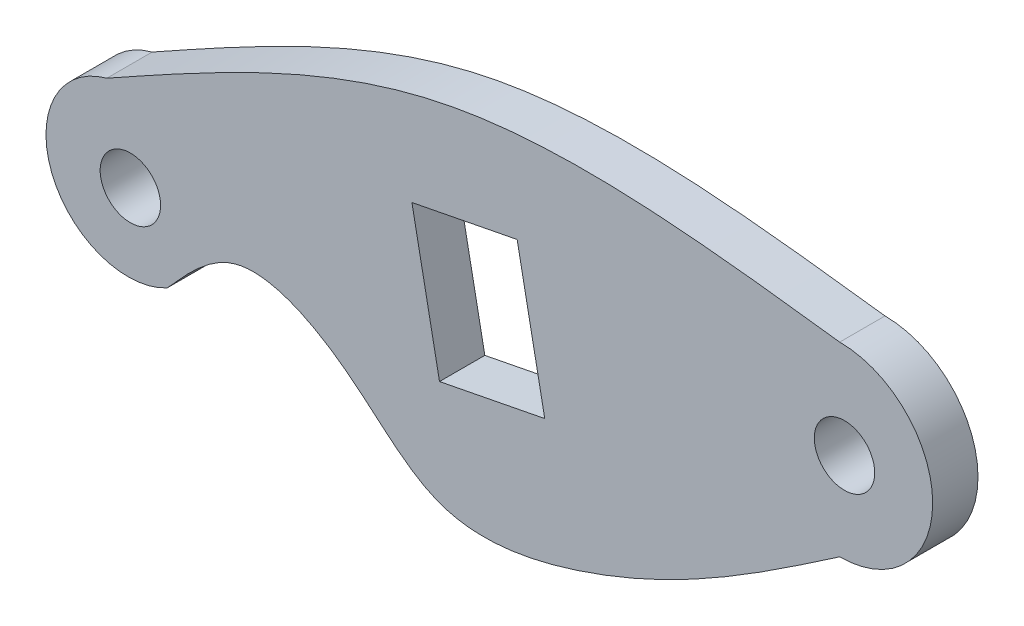
ISO-10303-21;
HEADER;
FILE_DESCRIPTION(('STEP AP214'),'2;1');
FILE_NAME('part.step','',(''),(''),'','','');
FILE_SCHEMA(('AUTOMOTIVE_DESIGN { 1 0 10303 214 1 1 1 1 }'));
ENDSEC;
DATA;
#1=APPLICATION_CONTEXT('core data for automotive mechanical design processes');
#2=APPLICATION_PROTOCOL_DEFINITION('international standard','automotive_design',2000,#1);
#3=PRODUCT_CONTEXT('',#1,'mechanical');
#4=PRODUCT('Part','Part','',(#3));
#5=PRODUCT_RELATED_PRODUCT_CATEGORY('part','',(#4));
#6=PRODUCT_DEFINITION_FORMATION('','',#4);
#7=PRODUCT_DEFINITION_CONTEXT('part definition',#1,'design');
#8=PRODUCT_DEFINITION('design','',#6,#7);
#9=PRODUCT_DEFINITION_SHAPE('','',#8);
#10=(LENGTH_UNIT() NAMED_UNIT(*) SI_UNIT(.MILLI.,.METRE.));
#11=(NAMED_UNIT(*) PLANE_ANGLE_UNIT() SI_UNIT($,.RADIAN.));
#12=(NAMED_UNIT(*) SI_UNIT($,.STERADIAN.) SOLID_ANGLE_UNIT());
#13=UNCERTAINTY_MEASURE_WITH_UNIT(LENGTH_MEASURE(1.E-05),#10,'distance_accuracy_value','');
#14=(GEOMETRIC_REPRESENTATION_CONTEXT(3) GLOBAL_UNCERTAINTY_ASSIGNED_CONTEXT((#13)) GLOBAL_UNIT_ASSIGNED_CONTEXT((#10,
#11,#12)) REPRESENTATION_CONTEXT('',''));
#15=CARTESIAN_POINT('',(0.,0.,0.));
#16=DIRECTION('',(0.,0.,1.));
#17=DIRECTION('',(1.,0.,0.));
#18=AXIS2_PLACEMENT_3D('',#15,#16,#17);
#19=CARTESIAN_POINT('',(-53.2520142800154,94.8575535673757,1.5));
#20=DIRECTION('',(0.,0.,1.));
#21=DIRECTION('',(1.,0.,0.));
#22=AXIS2_PLACEMENT_3D('',#19,#20,#21);
#23=PLANE('',#22);
#24=CARTESIAN_POINT('',(-64.074442722061,87.1747570230223,1.5));
#25=DIRECTION('',(0.,0.,1.));
#26=DIRECTION('',(1.,0.,0.));
#27=AXIS2_PLACEMENT_3D('',#24,#25,#26);
#28=CIRCLE('',#27,0.999999999999998);
#29=CARTESIAN_POINT('',(-63.074442722061,87.1747570230223,1.5));
#30=VERTEX_POINT('',#29);
#31=EDGE_CURVE('E121',#30,#30,#28,.T.);
#32=ORIENTED_EDGE('',*,*,#31,.F.);
#33=EDGE_LOOP('',(#32));
#34=FACE_BOUND('',#33,.T.);
#35=CARTESIAN_POINT('',(-40.5945010143821,94.4933990390098,1.5));
#36=CARTESIAN_POINT('',(-45.1067328716195,95.062315852806,1.5));
#37=CARTESIAN_POINT('',(-53.7128807725429,96.147406867134,1.5));
#38=CARTESIAN_POINT('',(-61.263255509961,91.9329155214449,1.5));
#39=CARTESIAN_POINT('',(-64.8549437576194,89.9280959512118,1.5));
#40=B_SPLINE_CURVE_WITH_KNOTS('',3,(#35,#36,#37,#38,#39),.UNSPECIFIED.,.F.,.F.,(4,1,4),(0.,
0.5243033130715,1.),.UNSPECIFIED.);
#41=CARTESIAN_POINT('',(-40.5945010143821,94.4933990390098,1.5));
#42=VERTEX_POINT('',#41);
#43=CARTESIAN_POINT('',(-64.8549437576194,89.9280959512118,1.5));
#44=VERTEX_POINT('',#43);
#45=EDGE_CURVE('E158',#42,#44,#40,.T.);
#46=ORIENTED_EDGE('',*,*,#45,.T.);
#47=CARTESIAN_POINT('',(-64.1510312334984,87.30442199767,1.5));
#48=DIRECTION('',(0.,0.,1.));
#49=DIRECTION('',(1.,0.,0.));
#50=AXIS2_PLACEMENT_3D('',#47,#48,#49);
#51=CIRCLE('',#50,2.71646053829389);
#52=CARTESIAN_POINT('',(-62.8550300147779,84.917051331606,1.5));
#53=VERTEX_POINT('',#52);
#54=EDGE_CURVE('E164',#44,#53,#51,.T.);
#55=ORIENTED_EDGE('',*,*,#54,.T.);
#56=CARTESIAN_POINT('',(-62.8550300147779,84.917051331606,1.5));
#57=CARTESIAN_POINT('',(-62.1426354203539,85.7170744292261,1.5));
#58=CARTESIAN_POINT('',(-60.5651319701729,87.4886195905712,1.5));
#59=CARTESIAN_POINT('',(-56.73967505305,85.7547090095442,1.5));
#60=CARTESIAN_POINT('',(-53.9883806957626,82.4347339404592,1.5));
#61=CARTESIAN_POINT('',(-47.13219288297,83.8775894546287,1.5));
#62=CARTESIAN_POINT('',(-43.2268502024927,86.5416881555137,1.5));
#63=CARTESIAN_POINT('',(-40.5945010143821,88.3373917918113,1.5));
#64=B_SPLINE_CURVE_WITH_KNOTS('',3,(#56,#57,#58,#59,#60,#61,#62,#63),.UNSPECIFIED.,.F.,.F.,(4,1,
1,1,1,4),(0.,0.116873357122585,0.258800565779375,0.422862059994074,0.610987124024471,1.),.UNSPECIFIED.);
#65=CARTESIAN_POINT('',(-40.5945010143821,88.3373917918113,1.5));
#66=VERTEX_POINT('',#65);
#67=EDGE_CURVE('E169',#53,#66,#64,.T.);
#68=ORIENTED_EDGE('',*,*,#67,.T.);
#69=CARTESIAN_POINT('',(-40.5945010143821,91.4153954154105,1.5));
#70=DIRECTION('',(0.,0.,1.));
#71=DIRECTION('',(1.,0.,0.));
#72=AXIS2_PLACEMENT_3D('',#69,#70,#71);
#73=CIRCLE('',#72,3.07800362359924);
#74=EDGE_CURVE('E174',#66,#42,#73,.T.);
#75=ORIENTED_EDGE('',*,*,#74,.T.);
#76=EDGE_LOOP('',(#46,#55,#68,#75));
#77=FACE_BOUND('',#76,.T.);
#78=DIRECTION('',(0.191745550151077,-0.981444671898147,0.));
#79=VECTOR('',#78,1.);
#80=CARTESIAN_POINT('',(-54.7545205643772,91.4153954154105,1.5));
#81=LINE('',#80,#79);
#82=CARTESIAN_POINT('',(-54.7545205643772,91.4153954154105,1.5));
#83=VERTEX_POINT('',#82);
#84=CARTESIAN_POINT('',(-53.8409709159905,86.7394150121251,1.5));
#85=VERTEX_POINT('',#84);
#86=EDGE_CURVE('E131',#83,#85,#81,.T.);
#87=ORIENTED_EDGE('',*,*,#86,.F.);
#88=DIRECTION('',(-0.981444671898147,-0.191745550151077,0.));
#89=VECTOR('',#88,1.);
#90=CARTESIAN_POINT('',(-51.2716932879771,92.0958378808049,1.5));
#91=LINE('',#90,#89);
#92=CARTESIAN_POINT('',(-51.2716932879771,92.0958378808049,1.5));
#93=VERTEX_POINT('',#92);
#94=EDGE_CURVE('E114',#93,#83,#91,.T.);
#95=ORIENTED_EDGE('',*,*,#94,.F.);
#96=DIRECTION('',(-0.191745550151077,0.981444671898147,0.));
#97=VECTOR('',#96,1.);
#98=CARTESIAN_POINT('',(-50.3581436395904,87.4198574775194,1.5));
#99=LINE('',#98,#97);
#100=CARTESIAN_POINT('',(-50.3581436395904,87.4198574775194,1.5));
#101=VERTEX_POINT('',#100);
#102=EDGE_CURVE('E135',#101,#93,#99,.T.);
#103=ORIENTED_EDGE('',*,*,#102,.F.);
#104=DIRECTION('',(0.981444671898147,0.191745550151077,0.));
#105=VECTOR('',#104,1.);
#106=CARTESIAN_POINT('',(-53.8409709159905,86.7394150121251,1.5));
#107=LINE('',#106,#105);
#108=EDGE_CURVE('E133',#85,#101,#107,.T.);
#109=ORIENTED_EDGE('',*,*,#108,.F.);
#110=EDGE_LOOP('',(#87,#95,#103,#109));
#111=FACE_BOUND('',#110,.T.);
#112=CARTESIAN_POINT('',(-40.4356239967167,91.3227986417033,1.5));
#113=DIRECTION('',(0.,0.,1.));
#114=DIRECTION('',(1.,0.,0.));
#115=AXIS2_PLACEMENT_3D('',#112,#113,#114);
#116=CIRCLE('',#115,0.999999999999998);
#117=CARTESIAN_POINT('',(-39.4356239967167,91.3227986417033,1.5));
#118=VERTEX_POINT('',#117);
#119=EDGE_CURVE('E226',#118,#118,#116,.T.);
#120=ORIENTED_EDGE('',*,*,#119,.F.);
#121=EDGE_LOOP('',(#120));
#122=FACE_BOUND('',#121,.T.);
#123=ADVANCED_FACE('F33',(#34,#77,#111,#122),#23,.T.);
#124=CARTESIAN_POINT('',(-53.2520142800154,94.8575535673757,0.));
#125=DIRECTION('',(0.,0.,1.));
#126=DIRECTION('',(1.,0.,0.));
#127=AXIS2_PLACEMENT_3D('',#124,#125,#126);
#128=PLANE('',#127);
#129=CARTESIAN_POINT('',(-64.074442722061,87.1747570230223,0.));
#130=DIRECTION('',(0.,0.,1.));
#131=DIRECTION('',(1.,0.,0.));
#132=AXIS2_PLACEMENT_3D('',#129,#130,#131);
#133=CIRCLE('',#132,0.999999999999998);
#134=CARTESIAN_POINT('',(-63.074442722061,87.1747570230223,0.));
#135=VERTEX_POINT('',#134);
#136=EDGE_CURVE('E124',#135,#135,#133,.T.);
#137=ORIENTED_EDGE('',*,*,#136,.T.);
#138=EDGE_LOOP('',(#137));
#139=FACE_BOUND('',#138,.T.);
#140=CARTESIAN_POINT('',(-40.5945010143821,94.4933990390098,0.));
#141=CARTESIAN_POINT('',(-45.1067328716195,95.062315852806,0.));
#142=CARTESIAN_POINT('',(-53.7128807725429,96.147406867134,0.));
#143=CARTESIAN_POINT('',(-61.263255509961,91.9329155214449,0.));
#144=CARTESIAN_POINT('',(-64.8549437576194,89.9280959512118,0.));
#145=B_SPLINE_CURVE_WITH_KNOTS('',3,(#140,#141,#142,#143,#144),.UNSPECIFIED.,.F.,.F.,(4,1,4),
(0.,0.5243033130715,1.),.UNSPECIFIED.);
#146=CARTESIAN_POINT('',(-40.5945010143821,94.4933990390098,0.));
#147=VERTEX_POINT('',#146);
#148=CARTESIAN_POINT('',(-64.8549437576194,89.9280959512118,0.));
#149=VERTEX_POINT('',#148);
#150=EDGE_CURVE('E115',#147,#149,#145,.T.);
#151=ORIENTED_EDGE('',*,*,#150,.F.);
#152=CARTESIAN_POINT('',(-40.5945010143821,91.4153954154105,0.));
#153=DIRECTION('',(0.,0.,1.));
#154=DIRECTION('',(1.,0.,0.));
#155=AXIS2_PLACEMENT_3D('',#152,#153,#154);
#156=CIRCLE('',#155,3.07800362359924);
#157=CARTESIAN_POINT('',(-40.5945010143821,88.3373917918113,0.));
#158=VERTEX_POINT('',#157);
#159=EDGE_CURVE('E154',#158,#147,#156,.T.);
#160=ORIENTED_EDGE('',*,*,#159,.F.);
#161=CARTESIAN_POINT('',(-62.8550300147779,84.917051331606,0.));
#162=CARTESIAN_POINT('',(-62.1426354203539,85.7170744292261,0.));
#163=CARTESIAN_POINT('',(-60.5651319701729,87.4886195905712,0.));
#164=CARTESIAN_POINT('',(-56.73967505305,85.7547090095442,0.));
#165=CARTESIAN_POINT('',(-53.9883806957626,82.4347339404592,0.));
#166=CARTESIAN_POINT('',(-47.13219288297,83.8775894546287,0.));
#167=CARTESIAN_POINT('',(-43.2268502024927,86.5416881555137,0.));
#168=CARTESIAN_POINT('',(-40.5945010143821,88.3373917918113,0.));
#169=B_SPLINE_CURVE_WITH_KNOTS('',3,(#161,#162,#163,#164,#165,#166,#167,#168),.UNSPECIFIED.,.F.,
.F.,(4,1,1,1,1,4),(0.,0.116873357122585,0.258800565779375,0.422862059994074,0.610987124024471,
1.),.UNSPECIFIED.);
#170=CARTESIAN_POINT('',(-62.8550300147779,84.917051331606,0.));
#171=VERTEX_POINT('',#170);
#172=EDGE_CURVE('E150',#171,#158,#169,.T.);
#173=ORIENTED_EDGE('',*,*,#172,.F.);
#174=CARTESIAN_POINT('',(-64.1510312334984,87.30442199767,0.));
#175=DIRECTION('',(0.,0.,1.));
#176=DIRECTION('',(1.,0.,0.));
#177=AXIS2_PLACEMENT_3D('',#174,#175,#176);
#178=CIRCLE('',#177,2.71646053829389);
#179=EDGE_CURVE('E145',#149,#171,#178,.T.);
#180=ORIENTED_EDGE('',*,*,#179,.F.);
#181=EDGE_LOOP('',(#151,#160,#173,#180));
#182=FACE_BOUND('',#181,.T.);
#183=DIRECTION('',(-0.981444671898147,-0.191745550151077,0.));
#184=VECTOR('',#183,1.);
#185=CARTESIAN_POINT('',(-51.2716932879771,92.0958378808049,0.));
#186=LINE('',#185,#184);
#187=CARTESIAN_POINT('',(-51.2716932879771,92.0958378808049,0.));
#188=VERTEX_POINT('',#187);
#189=CARTESIAN_POINT('',(-54.7545205643772,91.4153954154105,0.));
#190=VERTEX_POINT('',#189);
#191=EDGE_CURVE('E57',#188,#190,#186,.T.);
#192=ORIENTED_EDGE('',*,*,#191,.T.);
#193=DIRECTION('',(0.191745550151077,-0.981444671898147,0.));
#194=VECTOR('',#193,1.);
#195=CARTESIAN_POINT('',(-54.7545205643772,91.4153954154105,0.));
#196=LINE('',#195,#194);
#197=CARTESIAN_POINT('',(-53.8409709159905,86.7394150121251,0.));
#198=VERTEX_POINT('',#197);
#199=EDGE_CURVE('E101',#190,#198,#196,.T.);
#200=ORIENTED_EDGE('',*,*,#199,.T.);
#201=DIRECTION('',(0.981444671898147,0.191745550151077,0.));
#202=VECTOR('',#201,1.);
#203=CARTESIAN_POINT('',(-53.8409709159905,86.7394150121251,0.));
#204=LINE('',#203,#202);
#205=CARTESIAN_POINT('',(-50.3581436395904,87.4198574775194,0.));
#206=VERTEX_POINT('',#205);
#207=EDGE_CURVE('E110',#198,#206,#204,.T.);
#208=ORIENTED_EDGE('',*,*,#207,.T.);
#209=DIRECTION('',(-0.191745550151077,0.981444671898147,0.));
#210=VECTOR('',#209,1.);
#211=CARTESIAN_POINT('',(-50.3581436395904,87.4198574775194,0.));
#212=LINE('',#211,#210);
#213=EDGE_CURVE('E120',#206,#188,#212,.T.);
#214=ORIENTED_EDGE('',*,*,#213,.T.);
#215=EDGE_LOOP('',(#192,#200,#208,#214));
#216=FACE_BOUND('',#215,.T.);
#217=CARTESIAN_POINT('',(-40.4356239967167,91.3227986417033,0.));
#218=DIRECTION('',(0.,0.,1.));
#219=DIRECTION('',(1.,0.,0.));
#220=AXIS2_PLACEMENT_3D('',#217,#218,#219);
#221=CIRCLE('',#220,0.999999999999998);
#222=CARTESIAN_POINT('',(-39.4356239967167,91.3227986417033,0.));
#223=VERTEX_POINT('',#222);
#224=EDGE_CURVE('E229',#223,#223,#221,.T.);
#225=ORIENTED_EDGE('',*,*,#224,.T.);
#226=EDGE_LOOP('',(#225));
#227=FACE_BOUND('',#226,.T.);
#228=ADVANCED_FACE('F118',(#139,#182,#216,#227),#128,.F.);
#229=DIRECTION('',(0.,0.,-1.));
#230=VECTOR('',#229,1.);
#231=SURFACE_OF_LINEAR_EXTRUSION('',#40,#230);
#232=ORIENTED_EDGE('',*,*,#150,.T.);
#233=DIRECTION('',(0.,0.,-1.));
#234=VECTOR('',#233,1.);
#235=CARTESIAN_POINT('',(-64.8549437576194,89.9280959512118,1.5));
#236=LINE('',#235,#234);
#237=EDGE_CURVE('E11',#44,#149,#236,.T.);
#238=ORIENTED_EDGE('',*,*,#237,.F.);
#239=ORIENTED_EDGE('',*,*,#45,.F.);
#240=DIRECTION('',(0.,0.,-1.));
#241=VECTOR('',#240,1.);
#242=CARTESIAN_POINT('',(-40.5945010143821,94.4933990390098,1.5));
#243=LINE('',#242,#241);
#244=EDGE_CURVE('E243',#42,#147,#243,.T.);
#245=ORIENTED_EDGE('',*,*,#244,.T.);
#246=EDGE_LOOP('',(#232,#238,#239,#245));
#247=FACE_BOUND('',#246,.T.);
#248=ADVANCED_FACE('F35',(#247),#231,.F.);
#249=CARTESIAN_POINT('',(-64.1510312334984,87.30442199767,1.5));
#250=DIRECTION('',(0.,0.,-1.));
#251=DIRECTION('',(-1.,0.,0.));
#252=AXIS2_PLACEMENT_3D('',#249,#250,#251);
#253=CYLINDRICAL_SURFACE('',#252,2.71646053829389);
#254=ORIENTED_EDGE('',*,*,#179,.T.);
#255=DIRECTION('',(0.,0.,-1.));
#256=VECTOR('',#255,1.);
#257=CARTESIAN_POINT('',(-62.8550300147779,84.917051331606,1.5));
#258=LINE('',#257,#256);
#259=EDGE_CURVE('E42',#53,#171,#258,.T.);
#260=ORIENTED_EDGE('',*,*,#259,.F.);
#261=ORIENTED_EDGE('',*,*,#54,.F.);
#262=ORIENTED_EDGE('',*,*,#237,.T.);
#263=EDGE_LOOP('',(#254,#260,#261,#262));
#264=FACE_BOUND('',#263,.T.);
#265=ADVANCED_FACE('F184',(#264),#253,.T.);
#266=DIRECTION('',(0.,0.,-1.));
#267=VECTOR('',#266,1.);
#268=SURFACE_OF_LINEAR_EXTRUSION('',#64,#267);
#269=ORIENTED_EDGE('',*,*,#172,.T.);
#270=DIRECTION('',(0.,0.,-1.));
#271=VECTOR('',#270,1.);
#272=CARTESIAN_POINT('',(-40.5945010143821,88.3373917918113,1.5));
#273=LINE('',#272,#271);
#274=EDGE_CURVE('E246',#66,#158,#273,.T.);
#275=ORIENTED_EDGE('',*,*,#274,.F.);
#276=ORIENTED_EDGE('',*,*,#67,.F.);
#277=ORIENTED_EDGE('',*,*,#259,.T.);
#278=EDGE_LOOP('',(#269,#275,#276,#277));
#279=FACE_BOUND('',#278,.T.);
#280=ADVANCED_FACE('F180',(#279),#268,.F.);
#281=CARTESIAN_POINT('',(-40.5945010143821,91.4153954154105,1.5));
#282=DIRECTION('',(0.,0.,-1.));
#283=DIRECTION('',(-1.,0.,0.));
#284=AXIS2_PLACEMENT_3D('',#281,#282,#283);
#285=CYLINDRICAL_SURFACE('',#284,3.07800362359924);
#286=ORIENTED_EDGE('',*,*,#159,.T.);
#287=ORIENTED_EDGE('',*,*,#244,.F.);
#288=ORIENTED_EDGE('',*,*,#74,.F.);
#289=ORIENTED_EDGE('',*,*,#274,.T.);
#290=EDGE_LOOP('',(#286,#287,#288,#289));
#291=FACE_BOUND('',#290,.T.);
#292=ADVANCED_FACE('F183',(#291),#285,.T.);
#293=CARTESIAN_POINT('',(-51.2716932879771,92.0958378808049,1.5));
#294=DIRECTION('',(0.191745550151077,-0.981444671898147,0.));
#295=DIRECTION('',(0.981444671898147,0.191745550151077,0.));
#296=AXIS2_PLACEMENT_3D('',#293,#294,#295);
#297=PLANE('',#296);
#298=ORIENTED_EDGE('',*,*,#191,.F.);
#299=DIRECTION('',(0.,0.,-1.));
#300=VECTOR('',#299,1.);
#301=CARTESIAN_POINT('',(-51.2716932879771,92.0958378808049,1.5));
#302=LINE('',#301,#300);
#303=EDGE_CURVE('E137',#93,#188,#302,.T.);
#304=ORIENTED_EDGE('',*,*,#303,.F.);
#305=ORIENTED_EDGE('',*,*,#94,.T.);
#306=DIRECTION('',(0.,0.,-1.));
#307=VECTOR('',#306,1.);
#308=CARTESIAN_POINT('',(-54.7545205643772,91.4153954154105,1.5));
#309=LINE('',#308,#307);
#310=EDGE_CURVE('E103',#83,#190,#309,.T.);
#311=ORIENTED_EDGE('',*,*,#310,.T.);
#312=EDGE_LOOP('',(#298,#304,#305,#311));
#313=FACE_BOUND('',#312,.T.);
#314=ADVANCED_FACE('F112',(#313),#297,.T.);
#315=CARTESIAN_POINT('',(-54.7545205643772,91.4153954154105,1.5));
#316=DIRECTION('',(0.981444671898147,0.191745550151077,0.));
#317=DIRECTION('',(-0.191745550151077,0.981444671898147,0.));
#318=AXIS2_PLACEMENT_3D('',#315,#316,#317);
#319=PLANE('',#318);
#320=ORIENTED_EDGE('',*,*,#199,.F.);
#321=ORIENTED_EDGE('',*,*,#310,.F.);
#322=ORIENTED_EDGE('',*,*,#86,.T.);
#323=DIRECTION('',(0.,0.,-1.));
#324=VECTOR('',#323,1.);
#325=CARTESIAN_POINT('',(-53.8409709159905,86.7394150121251,1.5));
#326=LINE('',#325,#324);
#327=EDGE_CURVE('E106',#85,#198,#326,.T.);
#328=ORIENTED_EDGE('',*,*,#327,.T.);
#329=EDGE_LOOP('',(#320,#321,#322,#328));
#330=FACE_BOUND('',#329,.T.);
#331=ADVANCED_FACE('F102',(#330),#319,.T.);
#332=CARTESIAN_POINT('',(-53.8409709159905,86.7394150121251,1.5));
#333=DIRECTION('',(-0.191745550151077,0.981444671898147,0.));
#334=DIRECTION('',(-0.981444671898147,-0.191745550151077,0.));
#335=AXIS2_PLACEMENT_3D('',#332,#333,#334);
#336=PLANE('',#335);
#337=ORIENTED_EDGE('',*,*,#207,.F.);
#338=ORIENTED_EDGE('',*,*,#327,.F.);
#339=ORIENTED_EDGE('',*,*,#108,.T.);
#340=DIRECTION('',(0.,0.,-1.));
#341=VECTOR('',#340,1.);
#342=CARTESIAN_POINT('',(-50.3581436395904,87.4198574775194,1.5));
#343=LINE('',#342,#341);
#344=EDGE_CURVE('E49',#101,#206,#343,.T.);
#345=ORIENTED_EDGE('',*,*,#344,.T.);
#346=EDGE_LOOP('',(#337,#338,#339,#345));
#347=FACE_BOUND('',#346,.T.);
#348=ADVANCED_FACE('F207',(#347),#336,.T.);
#349=CARTESIAN_POINT('',(-50.3581436395904,87.4198574775194,1.5));
#350=DIRECTION('',(-0.981444671898147,-0.191745550151077,0.));
#351=DIRECTION('',(0.191745550151077,-0.981444671898147,0.));
#352=AXIS2_PLACEMENT_3D('',#349,#350,#351);
#353=PLANE('',#352);
#354=ORIENTED_EDGE('',*,*,#213,.F.);
#355=ORIENTED_EDGE('',*,*,#344,.F.);
#356=ORIENTED_EDGE('',*,*,#102,.T.);
#357=ORIENTED_EDGE('',*,*,#303,.T.);
#358=EDGE_LOOP('',(#354,#355,#356,#357));
#359=FACE_BOUND('',#358,.T.);
#360=ADVANCED_FACE('F210',(#359),#353,.T.);
#361=CARTESIAN_POINT('',(-64.074442722061,87.1747570230223,1.5));
#362=DIRECTION('',(0.,0.,-1.));
#363=DIRECTION('',(-1.,0.,0.));
#364=AXIS2_PLACEMENT_3D('',#361,#362,#363);
#365=CYLINDRICAL_SURFACE('',#364,0.999999999999998);
#366=ORIENTED_EDGE('',*,*,#31,.T.);
#367=EDGE_LOOP('',(#366));
#368=FACE_BOUND('',#367,.T.);
#369=ORIENTED_EDGE('',*,*,#136,.F.);
#370=EDGE_LOOP('',(#369));
#371=FACE_BOUND('',#370,.T.);
#372=ADVANCED_FACE('F214',(#368,#371),#365,.F.);
#373=CARTESIAN_POINT('',(-40.4356239967167,91.3227986417033,1.5));
#374=DIRECTION('',(0.,0.,-1.));
#375=DIRECTION('',(-1.,0.,0.));
#376=AXIS2_PLACEMENT_3D('',#373,#374,#375);
#377=CYLINDRICAL_SURFACE('',#376,0.999999999999998);
#378=ORIENTED_EDGE('',*,*,#119,.T.);
#379=EDGE_LOOP('',(#378));
#380=FACE_BOUND('',#379,.T.);
#381=ORIENTED_EDGE('',*,*,#224,.F.);
#382=EDGE_LOOP('',(#381));
#383=FACE_BOUND('',#382,.T.);
#384=ADVANCED_FACE('F217',(#380,#383),#377,.F.);
#385=CLOSED_SHELL('',(#123,#228,#248,#265,#280,#292,#314,#331,#348,#360,#372,#384));
#386=MANIFOLD_SOLID_BREP('B2',#385);
#387=ADVANCED_BREP_SHAPE_REPRESENTATION('',(#18,#386),#14);
#388=SHAPE_DEFINITION_REPRESENTATION(#9,#387);
ENDSEC;
END-ISO-10303-21;
